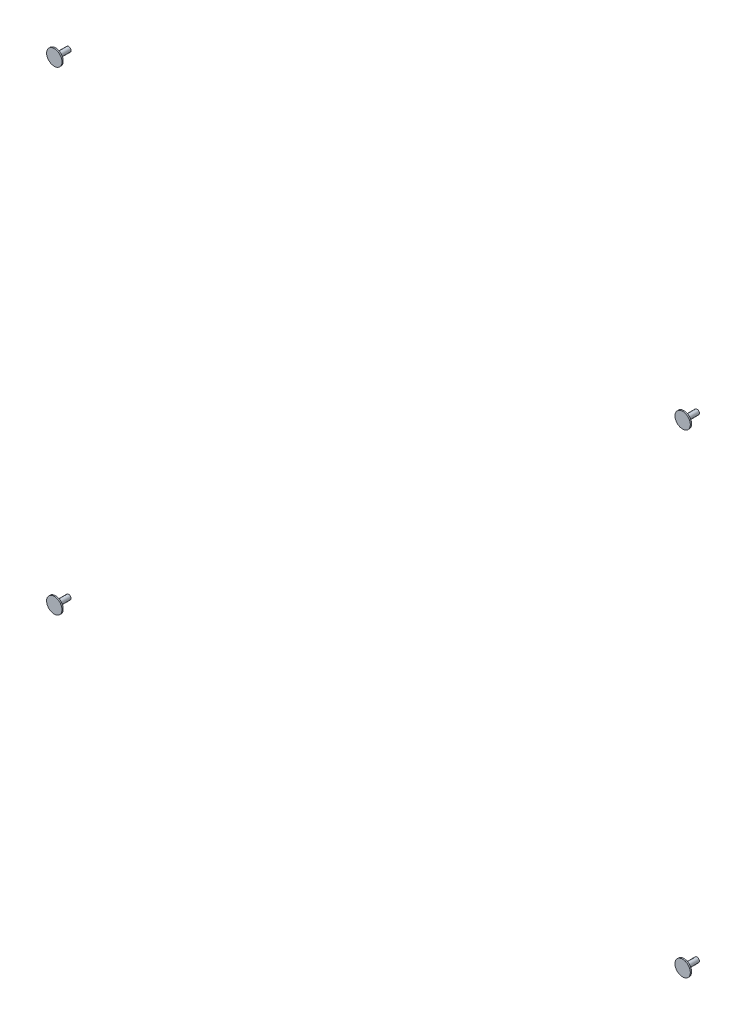
ISO-10303-21;
HEADER;
FILE_DESCRIPTION(('STEP AP214'),'2;1');
FILE_NAME('part.step','',(''),(''),'','','');
FILE_SCHEMA(('AUTOMOTIVE_DESIGN { 1 0 10303 214 1 1 1 1 }'));
ENDSEC;
DATA;
#1=APPLICATION_CONTEXT('core data for automotive mechanical design processes');
#2=APPLICATION_PROTOCOL_DEFINITION('international standard','automotive_design',2000,#1);
#3=PRODUCT_CONTEXT('',#1,'mechanical');
#4=PRODUCT('Part','Part','',(#3));
#5=PRODUCT_RELATED_PRODUCT_CATEGORY('part','',(#4));
#6=PRODUCT_DEFINITION_FORMATION('','',#4);
#7=PRODUCT_DEFINITION_CONTEXT('part definition',#1,'design');
#8=PRODUCT_DEFINITION('design','',#6,#7);
#9=PRODUCT_DEFINITION_SHAPE('','',#8);
#10=(LENGTH_UNIT() NAMED_UNIT(*) SI_UNIT(.MILLI.,.METRE.));
#11=(NAMED_UNIT(*) PLANE_ANGLE_UNIT() SI_UNIT($,.RADIAN.));
#12=(NAMED_UNIT(*) SI_UNIT($,.STERADIAN.) SOLID_ANGLE_UNIT());
#13=UNCERTAINTY_MEASURE_WITH_UNIT(LENGTH_MEASURE(1.E-05),#10,'distance_accuracy_value','');
#14=(GEOMETRIC_REPRESENTATION_CONTEXT(3) GLOBAL_UNCERTAINTY_ASSIGNED_CONTEXT((#13)) GLOBAL_UNIT_ASSIGNED_CONTEXT((#10,
#11,#12)) REPRESENTATION_CONTEXT('',''));
#15=CARTESIAN_POINT('',(0.,0.,0.));
#16=DIRECTION('',(0.,0.,1.));
#17=DIRECTION('',(1.,0.,0.));
#18=AXIS2_PLACEMENT_3D('',#15,#16,#17);
#19=CARTESIAN_POINT('',(-245.,-185.,107.8));
#20=DIRECTION('',(0.,0.,-1.));
#21=DIRECTION('',(-1.,0.,0.));
#22=AXIS2_PLACEMENT_3D('',#19,#20,#21);
#23=PLANE('',#22);
#24=CARTESIAN_POINT('',(-245.,-185.,107.8));
#25=DIRECTION('',(0.,0.,1.));
#26=DIRECTION('',(1.,0.,0.));
#27=AXIS2_PLACEMENT_3D('',#24,#25,#26);
#28=CIRCLE('',#27,1.9);
#29=CARTESIAN_POINT('',(-243.1,-185.,107.8));
#30=VERTEX_POINT('',#29);
#31=EDGE_CURVE('P0_E23',#30,#30,#28,.T.);
#32=ORIENTED_EDGE('',*,*,#31,.F.);
#33=EDGE_LOOP('',(#32));
#34=FACE_BOUND('',#33,.T.);
#35=ADVANCED_FACE('P0_F15',(#34),#23,.T.);
#36=CARTESIAN_POINT('',(-245.,-185.,107.8));
#37=DIRECTION('',(0.,0.,1.));
#38=DIRECTION('',(1.,0.,0.));
#39=AXIS2_PLACEMENT_3D('',#36,#37,#38);
#40=CYLINDRICAL_SURFACE('',#39,1.9);
#41=CARTESIAN_POINT('',(-245.,-185.,118.));
#42=DIRECTION('',(0.,0.,-1.));
#43=DIRECTION('',(-1.,0.,0.));
#44=AXIS2_PLACEMENT_3D('',#41,#42,#43);
#45=CIRCLE('',#44,1.9);
#46=CARTESIAN_POINT('',(-246.9,-185.,118.));
#47=VERTEX_POINT('',#46);
#48=EDGE_CURVE('P0_E10',#47,#47,#45,.F.);
#49=ORIENTED_EDGE('',*,*,#48,.F.);
#50=EDGE_LOOP('',(#49));
#51=FACE_BOUND('',#50,.T.);
#52=ORIENTED_EDGE('',*,*,#31,.T.);
#53=EDGE_LOOP('',(#52));
#54=FACE_BOUND('',#53,.T.);
#55=ADVANCED_FACE('P0_F17',(#51,#54),#40,.T.);
#56=CARTESIAN_POINT('',(-245.,-185.,119.));
#57=DIRECTION('',(0.,0.,1.));
#58=DIRECTION('',(1.,0.,0.));
#59=AXIS2_PLACEMENT_3D('',#56,#57,#58);
#60=PLANE('',#59);
#61=CARTESIAN_POINT('',(-245.,-185.,119.));
#62=DIRECTION('',(0.,0.,-1.));
#63=DIRECTION('',(-1.,0.,0.));
#64=AXIS2_PLACEMENT_3D('',#61,#62,#63);
#65=CIRCLE('',#64,6.);
#66=CARTESIAN_POINT('',(-251.,-185.,119.));
#67=VERTEX_POINT('',#66);
#68=EDGE_CURVE('P0_E29',#67,#67,#65,.T.);
#69=ORIENTED_EDGE('',*,*,#68,.F.);
#70=EDGE_LOOP('',(#69));
#71=FACE_BOUND('',#70,.T.);
#72=ADVANCED_FACE('P0_F45',(#71),#60,.T.);
#73=CARTESIAN_POINT('',(-245.,-185.,118.));
#74=DIRECTION('',(0.,0.,-1.));
#75=DIRECTION('',(-1.,0.,0.));
#76=AXIS2_PLACEMENT_3D('',#73,#74,#75);
#77=PLANE('',#76);
#78=ORIENTED_EDGE('',*,*,#48,.T.);
#79=EDGE_LOOP('',(#78));
#80=FACE_BOUND('',#79,.T.);
#81=CARTESIAN_POINT('',(-245.,-185.,118.));
#82=DIRECTION('',(0.,0.,1.));
#83=DIRECTION('',(1.,0.,0.));
#84=AXIS2_PLACEMENT_3D('',#81,#82,#83);
#85=CIRCLE('',#84,6.);
#86=CARTESIAN_POINT('',(-239.,-185.,118.));
#87=VERTEX_POINT('',#86);
#88=EDGE_CURVE('P0_E34',#87,#87,#85,.T.);
#89=ORIENTED_EDGE('',*,*,#88,.F.);
#90=EDGE_LOOP('',(#89));
#91=FACE_BOUND('',#90,.T.);
#92=ADVANCED_FACE('P0_F43',(#80,#91),#77,.T.);
#93=CARTESIAN_POINT('',(-245.,-185.,118.));
#94=DIRECTION('',(0.,0.,1.));
#95=DIRECTION('',(1.,0.,0.));
#96=AXIS2_PLACEMENT_3D('',#93,#94,#95);
#97=CYLINDRICAL_SURFACE('',#96,6.);
#98=ORIENTED_EDGE('',*,*,#68,.T.);
#99=EDGE_LOOP('',(#98));
#100=FACE_BOUND('',#99,.T.);
#101=ORIENTED_EDGE('',*,*,#88,.T.);
#102=EDGE_LOOP('',(#101));
#103=FACE_BOUND('',#102,.T.);
#104=ADVANCED_FACE('P0_F41',(#100,#103),#97,.T.);
#105=CLOSED_SHELL('',(#35,#55,#72,#92,#104));
#106=MANIFOLD_SOLID_BREP('P0_B1',#105);
#107=CARTESIAN_POINT('',(-245.,185.,107.8));
#108=DIRECTION('',(0.,0.,-1.));
#109=DIRECTION('',(-1.,0.,0.));
#110=AXIS2_PLACEMENT_3D('',#107,#108,#109);
#111=PLANE('',#110);
#112=CARTESIAN_POINT('',(-245.,185.,107.8));
#113=DIRECTION('',(0.,0.,1.));
#114=DIRECTION('',(1.,0.,0.));
#115=AXIS2_PLACEMENT_3D('',#112,#113,#114);
#116=CIRCLE('',#115,1.9);
#117=CARTESIAN_POINT('',(-243.1,185.,107.8));
#118=VERTEX_POINT('',#117);
#119=EDGE_CURVE('P1_E23',#118,#118,#116,.T.);
#120=ORIENTED_EDGE('',*,*,#119,.F.);
#121=EDGE_LOOP('',(#120));
#122=FACE_BOUND('',#121,.T.);
#123=ADVANCED_FACE('P1_F15',(#122),#111,.T.);
#124=CARTESIAN_POINT('',(-245.,185.,107.8));
#125=DIRECTION('',(0.,0.,1.));
#126=DIRECTION('',(1.,0.,0.));
#127=AXIS2_PLACEMENT_3D('',#124,#125,#126);
#128=CYLINDRICAL_SURFACE('',#127,1.9);
#129=CARTESIAN_POINT('',(-245.,185.,118.));
#130=DIRECTION('',(0.,0.,-1.));
#131=DIRECTION('',(-1.,0.,0.));
#132=AXIS2_PLACEMENT_3D('',#129,#130,#131);
#133=CIRCLE('',#132,1.9);
#134=CARTESIAN_POINT('',(-246.9,185.,118.));
#135=VERTEX_POINT('',#134);
#136=EDGE_CURVE('P1_E10',#135,#135,#133,.F.);
#137=ORIENTED_EDGE('',*,*,#136,.F.);
#138=EDGE_LOOP('',(#137));
#139=FACE_BOUND('',#138,.T.);
#140=ORIENTED_EDGE('',*,*,#119,.T.);
#141=EDGE_LOOP('',(#140));
#142=FACE_BOUND('',#141,.T.);
#143=ADVANCED_FACE('P1_F17',(#139,#142),#128,.T.);
#144=CARTESIAN_POINT('',(-245.,185.,119.));
#145=DIRECTION('',(0.,0.,1.));
#146=DIRECTION('',(1.,0.,0.));
#147=AXIS2_PLACEMENT_3D('',#144,#145,#146);
#148=PLANE('',#147);
#149=CARTESIAN_POINT('',(-245.,185.,119.));
#150=DIRECTION('',(0.,0.,-1.));
#151=DIRECTION('',(-1.,0.,0.));
#152=AXIS2_PLACEMENT_3D('',#149,#150,#151);
#153=CIRCLE('',#152,6.);
#154=CARTESIAN_POINT('',(-251.,185.,119.));
#155=VERTEX_POINT('',#154);
#156=EDGE_CURVE('P1_E31',#155,#155,#153,.T.);
#157=ORIENTED_EDGE('',*,*,#156,.F.);
#158=EDGE_LOOP('',(#157));
#159=FACE_BOUND('',#158,.T.);
#160=ADVANCED_FACE('P1_F45',(#159),#148,.T.);
#161=CARTESIAN_POINT('',(-245.,185.,118.));
#162=DIRECTION('',(0.,0.,-1.));
#163=DIRECTION('',(-1.,0.,0.));
#164=AXIS2_PLACEMENT_3D('',#161,#162,#163);
#165=PLANE('',#164);
#166=ORIENTED_EDGE('',*,*,#136,.T.);
#167=EDGE_LOOP('',(#166));
#168=FACE_BOUND('',#167,.T.);
#169=CARTESIAN_POINT('',(-245.,185.,118.));
#170=DIRECTION('',(0.,0.,1.));
#171=DIRECTION('',(1.,0.,0.));
#172=AXIS2_PLACEMENT_3D('',#169,#170,#171);
#173=CIRCLE('',#172,6.);
#174=CARTESIAN_POINT('',(-239.,185.,118.));
#175=VERTEX_POINT('',#174);
#176=EDGE_CURVE('P1_E35',#175,#175,#173,.T.);
#177=ORIENTED_EDGE('',*,*,#176,.F.);
#178=EDGE_LOOP('',(#177));
#179=FACE_BOUND('',#178,.T.);
#180=ADVANCED_FACE('P1_F43',(#168,#179),#165,.T.);
#181=CARTESIAN_POINT('',(-245.,185.,118.));
#182=DIRECTION('',(0.,0.,1.));
#183=DIRECTION('',(1.,0.,0.));
#184=AXIS2_PLACEMENT_3D('',#181,#182,#183);
#185=CYLINDRICAL_SURFACE('',#184,6.);
#186=ORIENTED_EDGE('',*,*,#156,.T.);
#187=EDGE_LOOP('',(#186));
#188=FACE_BOUND('',#187,.T.);
#189=ORIENTED_EDGE('',*,*,#176,.T.);
#190=EDGE_LOOP('',(#189));
#191=FACE_BOUND('',#190,.T.);
#192=ADVANCED_FACE('P1_F41',(#188,#191),#185,.T.);
#193=CLOSED_SHELL('',(#123,#143,#160,#180,#192));
#194=MANIFOLD_SOLID_BREP('P1_B1',#193);
#195=CARTESIAN_POINT('',(245.,-185.,107.8));
#196=DIRECTION('',(0.,0.,-1.));
#197=DIRECTION('',(-1.,0.,0.));
#198=AXIS2_PLACEMENT_3D('',#195,#196,#197);
#199=PLANE('',#198);
#200=CARTESIAN_POINT('',(245.,-185.,107.8));
#201=DIRECTION('',(0.,0.,1.));
#202=DIRECTION('',(1.,0.,0.));
#203=AXIS2_PLACEMENT_3D('',#200,#201,#202);
#204=CIRCLE('',#203,1.9);
#205=CARTESIAN_POINT('',(246.9,-185.,107.8));
#206=VERTEX_POINT('',#205);
#207=EDGE_CURVE('P2_E23',#206,#206,#204,.T.);
#208=ORIENTED_EDGE('',*,*,#207,.F.);
#209=EDGE_LOOP('',(#208));
#210=FACE_BOUND('',#209,.T.);
#211=ADVANCED_FACE('P2_F15',(#210),#199,.T.);
#212=CARTESIAN_POINT('',(245.,-185.,107.8));
#213=DIRECTION('',(0.,0.,1.));
#214=DIRECTION('',(1.,0.,0.));
#215=AXIS2_PLACEMENT_3D('',#212,#213,#214);
#216=CYLINDRICAL_SURFACE('',#215,1.9);
#217=CARTESIAN_POINT('',(245.,-185.,118.));
#218=DIRECTION('',(0.,0.,-1.));
#219=DIRECTION('',(-1.,0.,0.));
#220=AXIS2_PLACEMENT_3D('',#217,#218,#219);
#221=CIRCLE('',#220,1.9);
#222=CARTESIAN_POINT('',(243.1,-185.,118.));
#223=VERTEX_POINT('',#222);
#224=EDGE_CURVE('P2_E10',#223,#223,#221,.F.);
#225=ORIENTED_EDGE('',*,*,#224,.F.);
#226=EDGE_LOOP('',(#225));
#227=FACE_BOUND('',#226,.T.);
#228=ORIENTED_EDGE('',*,*,#207,.T.);
#229=EDGE_LOOP('',(#228));
#230=FACE_BOUND('',#229,.T.);
#231=ADVANCED_FACE('P2_F17',(#227,#230),#216,.T.);
#232=CARTESIAN_POINT('',(245.,-185.,119.));
#233=DIRECTION('',(0.,0.,1.));
#234=DIRECTION('',(1.,0.,0.));
#235=AXIS2_PLACEMENT_3D('',#232,#233,#234);
#236=PLANE('',#235);
#237=CARTESIAN_POINT('',(245.,-185.,119.));
#238=DIRECTION('',(0.,0.,-1.));
#239=DIRECTION('',(-1.,0.,0.));
#240=AXIS2_PLACEMENT_3D('',#237,#238,#239);
#241=CIRCLE('',#240,6.);
#242=CARTESIAN_POINT('',(239.,-185.,119.));
#243=VERTEX_POINT('',#242);
#244=EDGE_CURVE('P2_E29',#243,#243,#241,.T.);
#245=ORIENTED_EDGE('',*,*,#244,.F.);
#246=EDGE_LOOP('',(#245));
#247=FACE_BOUND('',#246,.T.);
#248=ADVANCED_FACE('P2_F45',(#247),#236,.T.);
#249=CARTESIAN_POINT('',(245.,-185.,118.));
#250=DIRECTION('',(0.,0.,-1.));
#251=DIRECTION('',(-1.,0.,0.));
#252=AXIS2_PLACEMENT_3D('',#249,#250,#251);
#253=PLANE('',#252);
#254=ORIENTED_EDGE('',*,*,#224,.T.);
#255=EDGE_LOOP('',(#254));
#256=FACE_BOUND('',#255,.T.);
#257=CARTESIAN_POINT('',(245.,-185.,118.));
#258=DIRECTION('',(0.,0.,1.));
#259=DIRECTION('',(1.,0.,0.));
#260=AXIS2_PLACEMENT_3D('',#257,#258,#259);
#261=CIRCLE('',#260,6.);
#262=CARTESIAN_POINT('',(251.,-185.,118.));
#263=VERTEX_POINT('',#262);
#264=EDGE_CURVE('P2_E35',#263,#263,#261,.T.);
#265=ORIENTED_EDGE('',*,*,#264,.F.);
#266=EDGE_LOOP('',(#265));
#267=FACE_BOUND('',#266,.T.);
#268=ADVANCED_FACE('P2_F43',(#256,#267),#253,.T.);
#269=CARTESIAN_POINT('',(245.,-185.,118.));
#270=DIRECTION('',(0.,0.,1.));
#271=DIRECTION('',(1.,0.,0.));
#272=AXIS2_PLACEMENT_3D('',#269,#270,#271);
#273=CYLINDRICAL_SURFACE('',#272,6.);
#274=ORIENTED_EDGE('',*,*,#244,.T.);
#275=EDGE_LOOP('',(#274));
#276=FACE_BOUND('',#275,.T.);
#277=ORIENTED_EDGE('',*,*,#264,.T.);
#278=EDGE_LOOP('',(#277));
#279=FACE_BOUND('',#278,.T.);
#280=ADVANCED_FACE('P2_F41',(#276,#279),#273,.T.);
#281=CLOSED_SHELL('',(#211,#231,#248,#268,#280));
#282=MANIFOLD_SOLID_BREP('P2_B1',#281);
#283=CARTESIAN_POINT('',(245.,185.,107.8));
#284=DIRECTION('',(0.,0.,-1.));
#285=DIRECTION('',(-1.,0.,0.));
#286=AXIS2_PLACEMENT_3D('',#283,#284,#285);
#287=PLANE('',#286);
#288=CARTESIAN_POINT('',(245.,185.,107.8));
#289=DIRECTION('',(0.,0.,1.));
#290=DIRECTION('',(1.,0.,0.));
#291=AXIS2_PLACEMENT_3D('',#288,#289,#290);
#292=CIRCLE('',#291,1.9);
#293=CARTESIAN_POINT('',(246.9,185.,107.8));
#294=VERTEX_POINT('',#293);
#295=EDGE_CURVE('P3_E23',#294,#294,#292,.T.);
#296=ORIENTED_EDGE('',*,*,#295,.F.);
#297=EDGE_LOOP('',(#296));
#298=FACE_BOUND('',#297,.T.);
#299=ADVANCED_FACE('P3_F15',(#298),#287,.T.);
#300=CARTESIAN_POINT('',(245.,185.,107.8));
#301=DIRECTION('',(0.,0.,1.));
#302=DIRECTION('',(1.,0.,0.));
#303=AXIS2_PLACEMENT_3D('',#300,#301,#302);
#304=CYLINDRICAL_SURFACE('',#303,1.9);
#305=CARTESIAN_POINT('',(245.,185.,118.));
#306=DIRECTION('',(0.,0.,-1.));
#307=DIRECTION('',(-1.,0.,0.));
#308=AXIS2_PLACEMENT_3D('',#305,#306,#307);
#309=CIRCLE('',#308,1.9);
#310=CARTESIAN_POINT('',(243.1,185.,118.));
#311=VERTEX_POINT('',#310);
#312=EDGE_CURVE('P3_E10',#311,#311,#309,.F.);
#313=ORIENTED_EDGE('',*,*,#312,.F.);
#314=EDGE_LOOP('',(#313));
#315=FACE_BOUND('',#314,.T.);
#316=ORIENTED_EDGE('',*,*,#295,.T.);
#317=EDGE_LOOP('',(#316));
#318=FACE_BOUND('',#317,.T.);
#319=ADVANCED_FACE('P3_F17',(#315,#318),#304,.T.);
#320=CARTESIAN_POINT('',(245.,185.,119.));
#321=DIRECTION('',(0.,0.,1.));
#322=DIRECTION('',(1.,0.,0.));
#323=AXIS2_PLACEMENT_3D('',#320,#321,#322);
#324=PLANE('',#323);
#325=CARTESIAN_POINT('',(245.,185.,119.));
#326=DIRECTION('',(0.,0.,-1.));
#327=DIRECTION('',(-1.,0.,0.));
#328=AXIS2_PLACEMENT_3D('',#325,#326,#327);
#329=CIRCLE('',#328,6.);
#330=CARTESIAN_POINT('',(239.,185.,119.));
#331=VERTEX_POINT('',#330);
#332=EDGE_CURVE('P3_E30',#331,#331,#329,.T.);
#333=ORIENTED_EDGE('',*,*,#332,.F.);
#334=EDGE_LOOP('',(#333));
#335=FACE_BOUND('',#334,.T.);
#336=ADVANCED_FACE('P3_F45',(#335),#324,.T.);
#337=CARTESIAN_POINT('',(245.,185.,118.));
#338=DIRECTION('',(0.,0.,-1.));
#339=DIRECTION('',(-1.,0.,0.));
#340=AXIS2_PLACEMENT_3D('',#337,#338,#339);
#341=PLANE('',#340);
#342=ORIENTED_EDGE('',*,*,#312,.T.);
#343=EDGE_LOOP('',(#342));
#344=FACE_BOUND('',#343,.T.);
#345=CARTESIAN_POINT('',(245.,185.,118.));
#346=DIRECTION('',(0.,0.,1.));
#347=DIRECTION('',(1.,0.,0.));
#348=AXIS2_PLACEMENT_3D('',#345,#346,#347);
#349=CIRCLE('',#348,6.);
#350=CARTESIAN_POINT('',(251.,185.,118.));
#351=VERTEX_POINT('',#350);
#352=EDGE_CURVE('P3_E35',#351,#351,#349,.T.);
#353=ORIENTED_EDGE('',*,*,#352,.F.);
#354=EDGE_LOOP('',(#353));
#355=FACE_BOUND('',#354,.T.);
#356=ADVANCED_FACE('P3_F43',(#344,#355),#341,.T.);
#357=CARTESIAN_POINT('',(245.,185.,118.));
#358=DIRECTION('',(0.,0.,1.));
#359=DIRECTION('',(1.,0.,0.));
#360=AXIS2_PLACEMENT_3D('',#357,#358,#359);
#361=CYLINDRICAL_SURFACE('',#360,6.);
#362=ORIENTED_EDGE('',*,*,#332,.T.);
#363=EDGE_LOOP('',(#362));
#364=FACE_BOUND('',#363,.T.);
#365=ORIENTED_EDGE('',*,*,#352,.T.);
#366=EDGE_LOOP('',(#365));
#367=FACE_BOUND('',#366,.T.);
#368=ADVANCED_FACE('P3_F41',(#364,#367),#361,.T.);
#369=CLOSED_SHELL('',(#299,#319,#336,#356,#368));
#370=MANIFOLD_SOLID_BREP('P3_B1',#369);
#371=ADVANCED_BREP_SHAPE_REPRESENTATION('',(#18,#106,#194,#282,#370),#14);
#372=SHAPE_DEFINITION_REPRESENTATION(#9,#371);
ENDSEC;
END-ISO-10303-21;
